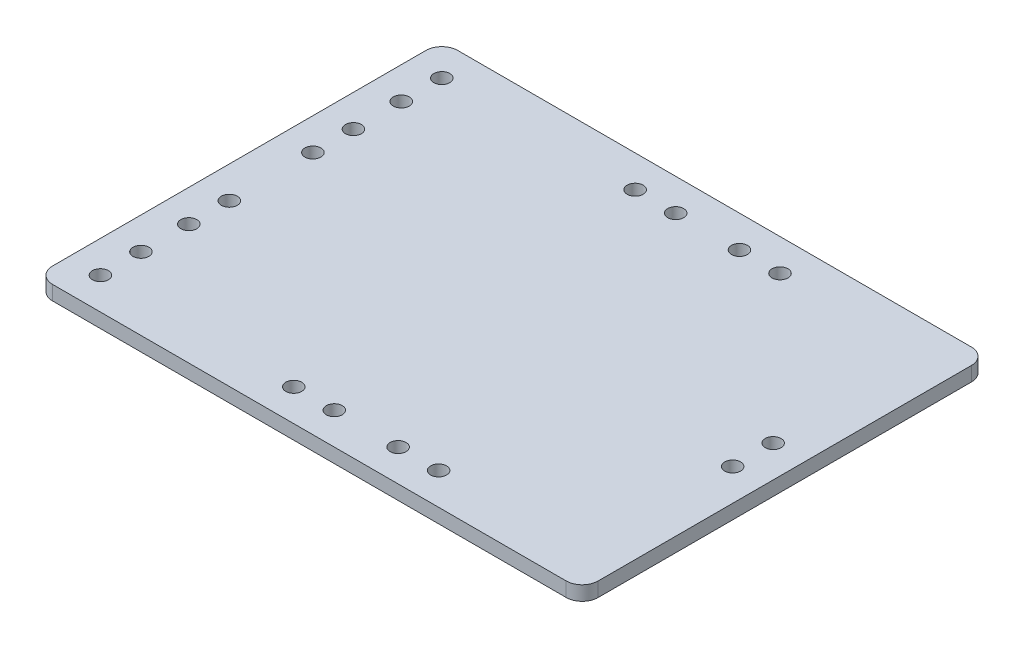
ISO-10303-21;
HEADER;
FILE_DESCRIPTION(('STEP AP214'),'2;1');
FILE_NAME('part.step','',(''),(''),'','','');
FILE_SCHEMA(('AUTOMOTIVE_DESIGN { 1 0 10303 214 1 1 1 1 }'));
ENDSEC;
DATA;
#1=APPLICATION_CONTEXT('core data for automotive mechanical design processes');
#2=APPLICATION_PROTOCOL_DEFINITION('international standard','automotive_design',2000,#1);
#3=PRODUCT_CONTEXT('',#1,'mechanical');
#4=PRODUCT('Part','Part','',(#3));
#5=PRODUCT_RELATED_PRODUCT_CATEGORY('part','',(#4));
#6=PRODUCT_DEFINITION_FORMATION('','',#4);
#7=PRODUCT_DEFINITION_CONTEXT('part definition',#1,'design');
#8=PRODUCT_DEFINITION('design','',#6,#7);
#9=PRODUCT_DEFINITION_SHAPE('','',#8);
#10=(LENGTH_UNIT() NAMED_UNIT(*) SI_UNIT(.MILLI.,.METRE.));
#11=(NAMED_UNIT(*) PLANE_ANGLE_UNIT() SI_UNIT($,.RADIAN.));
#12=(NAMED_UNIT(*) SI_UNIT($,.STERADIAN.) SOLID_ANGLE_UNIT());
#13=UNCERTAINTY_MEASURE_WITH_UNIT(LENGTH_MEASURE(1.E-05),#10,'distance_accuracy_value','');
#14=(GEOMETRIC_REPRESENTATION_CONTEXT(3) GLOBAL_UNCERTAINTY_ASSIGNED_CONTEXT((#13)) GLOBAL_UNIT_ASSIGNED_CONTEXT((#10,
#11,#12)) REPRESENTATION_CONTEXT('',''));
#15=CARTESIAN_POINT('',(0.,0.,0.));
#16=DIRECTION('',(0.,0.,1.));
#17=DIRECTION('',(1.,0.,0.));
#18=AXIS2_PLACEMENT_3D('',#15,#16,#17);
#19=CARTESIAN_POINT('',(-17.1,0.45,12.7));
#20=DIRECTION('',(1.,0.,0.));
#21=DIRECTION('',(0.,0.,-1.));
#22=AXIS2_PLACEMENT_3D('',#19,#20,#21);
#23=PLANE('',#22);
#24=DIRECTION('',(0.,0.,1.));
#25=VECTOR('',#24,1.);
#26=CARTESIAN_POINT('',(-17.1,0.45,12.7));
#27=LINE('',#26,#25);
#28=CARTESIAN_POINT('',(-17.1,0.45,-11.7));
#29=VERTEX_POINT('',#28);
#30=CARTESIAN_POINT('',(-17.1,0.45,11.7));
#31=VERTEX_POINT('',#30);
#32=EDGE_CURVE('E132',#29,#31,#27,.T.);
#33=ORIENTED_EDGE('',*,*,#32,.F.);
#34=DIRECTION('',(0.,-1.,0.));
#35=VECTOR('',#34,1.);
#36=CARTESIAN_POINT('',(-17.1,0.45,-11.7));
#37=LINE('',#36,#35);
#38=CARTESIAN_POINT('',(-17.1,-0.45,-11.7));
#39=VERTEX_POINT('',#38);
#40=EDGE_CURVE('E116',#29,#39,#37,.T.);
#41=ORIENTED_EDGE('',*,*,#40,.T.);
#42=DIRECTION('',(0.,0.,1.));
#43=VECTOR('',#42,1.);
#44=CARTESIAN_POINT('',(-17.1,-0.45,12.7));
#45=LINE('',#44,#43);
#46=CARTESIAN_POINT('',(-17.1,-0.45,11.7));
#47=VERTEX_POINT('',#46);
#48=EDGE_CURVE('E129',#39,#47,#45,.T.);
#49=ORIENTED_EDGE('',*,*,#48,.T.);
#50=DIRECTION('',(0.,-1.,0.));
#51=VECTOR('',#50,1.);
#52=CARTESIAN_POINT('',(-17.1,0.45,11.7));
#53=LINE('',#52,#51);
#54=EDGE_CURVE('E135',#47,#31,#53,.F.);
#55=ORIENTED_EDGE('',*,*,#54,.T.);
#56=EDGE_LOOP('',(#33,#41,#49,#55));
#57=FACE_BOUND('',#56,.T.);
#58=ADVANCED_FACE('F45',(#57),#23,.F.);
#59=CARTESIAN_POINT('',(17.1,0.45,12.7));
#60=DIRECTION('',(0.,0.,-1.));
#61=DIRECTION('',(-1.,0.,0.));
#62=AXIS2_PLACEMENT_3D('',#59,#60,#61);
#63=PLANE('',#62);
#64=DIRECTION('',(1.,0.,0.));
#65=VECTOR('',#64,1.);
#66=CARTESIAN_POINT('',(17.1,-0.45,12.7));
#67=LINE('',#66,#65);
#68=CARTESIAN_POINT('',(-16.1,-0.45,12.7));
#69=VERTEX_POINT('',#68);
#70=CARTESIAN_POINT('',(16.1,-0.45,12.7));
#71=VERTEX_POINT('',#70);
#72=EDGE_CURVE('E140',#69,#71,#67,.T.);
#73=ORIENTED_EDGE('',*,*,#72,.T.);
#74=DIRECTION('',(0.,-1.,0.));
#75=VECTOR('',#74,1.);
#76=CARTESIAN_POINT('',(16.1,0.45,12.7));
#77=LINE('',#76,#75);
#78=CARTESIAN_POINT('',(16.1,0.45,12.7));
#79=VERTEX_POINT('',#78);
#80=EDGE_CURVE('E11',#71,#79,#77,.F.);
#81=ORIENTED_EDGE('',*,*,#80,.T.);
#82=DIRECTION('',(1.,0.,0.));
#83=VECTOR('',#82,1.);
#84=CARTESIAN_POINT('',(17.1,0.45,12.7));
#85=LINE('',#84,#83);
#86=CARTESIAN_POINT('',(-16.1,0.45,12.7));
#87=VERTEX_POINT('',#86);
#88=EDGE_CURVE('E197',#87,#79,#85,.T.);
#89=ORIENTED_EDGE('',*,*,#88,.F.);
#90=DIRECTION('',(0.,-1.,0.));
#91=VECTOR('',#90,1.);
#92=CARTESIAN_POINT('',(-16.1,0.45,12.7));
#93=LINE('',#92,#91);
#94=EDGE_CURVE('E54',#87,#69,#93,.T.);
#95=ORIENTED_EDGE('',*,*,#94,.T.);
#96=EDGE_LOOP('',(#73,#81,#89,#95));
#97=FACE_BOUND('',#96,.T.);
#98=ADVANCED_FACE('F195',(#97),#63,.F.);
#99=CARTESIAN_POINT('',(17.1,0.45,12.7));
#100=DIRECTION('',(-1.,0.,0.));
#101=DIRECTION('',(0.,0.,1.));
#102=AXIS2_PLACEMENT_3D('',#99,#100,#101);
#103=PLANE('',#102);
#104=DIRECTION('',(0.,0.,-1.));
#105=VECTOR('',#104,1.);
#106=CARTESIAN_POINT('',(17.1,-0.45,12.7));
#107=LINE('',#106,#105);
#108=CARTESIAN_POINT('',(17.1,-0.45,11.7));
#109=VERTEX_POINT('',#108);
#110=CARTESIAN_POINT('',(17.1,-0.45,-11.7));
#111=VERTEX_POINT('',#110);
#112=EDGE_CURVE('E146',#109,#111,#107,.T.);
#113=ORIENTED_EDGE('',*,*,#112,.T.);
#114=DIRECTION('',(0.,-1.,0.));
#115=VECTOR('',#114,1.);
#116=CARTESIAN_POINT('',(17.1,0.45,-11.7));
#117=LINE('',#116,#115);
#118=CARTESIAN_POINT('',(17.1,0.45,-11.7));
#119=VERTEX_POINT('',#118);
#120=EDGE_CURVE('E61',#111,#119,#117,.F.);
#121=ORIENTED_EDGE('',*,*,#120,.T.);
#122=DIRECTION('',(0.,0.,-1.));
#123=VECTOR('',#122,1.);
#124=CARTESIAN_POINT('',(17.1,0.45,12.7));
#125=LINE('',#124,#123);
#126=CARTESIAN_POINT('',(17.1,0.45,11.7));
#127=VERTEX_POINT('',#126);
#128=EDGE_CURVE('E205',#127,#119,#125,.T.);
#129=ORIENTED_EDGE('',*,*,#128,.F.);
#130=DIRECTION('',(0.,-1.,0.));
#131=VECTOR('',#130,1.);
#132=CARTESIAN_POINT('',(17.1,0.45,11.7));
#133=LINE('',#132,#131);
#134=EDGE_CURVE('E185',#127,#109,#133,.T.);
#135=ORIENTED_EDGE('',*,*,#134,.T.);
#136=EDGE_LOOP('',(#113,#121,#129,#135));
#137=FACE_BOUND('',#136,.T.);
#138=ADVANCED_FACE('F204',(#137),#103,.F.);
#139=CARTESIAN_POINT('',(17.1,0.45,-12.7));
#140=DIRECTION('',(0.,0.,1.));
#141=DIRECTION('',(1.,0.,0.));
#142=AXIS2_PLACEMENT_3D('',#139,#140,#141);
#143=PLANE('',#142);
#144=DIRECTION('',(-1.,0.,0.));
#145=VECTOR('',#144,1.);
#146=CARTESIAN_POINT('',(17.1,-0.45,-12.7));
#147=LINE('',#146,#145);
#148=CARTESIAN_POINT('',(16.1,-0.45,-12.7));
#149=VERTEX_POINT('',#148);
#150=CARTESIAN_POINT('',(-16.1,-0.45,-12.7));
#151=VERTEX_POINT('',#150);
#152=EDGE_CURVE('E157',#149,#151,#147,.T.);
#153=ORIENTED_EDGE('',*,*,#152,.T.);
#154=DIRECTION('',(0.,-1.,0.));
#155=VECTOR('',#154,1.);
#156=CARTESIAN_POINT('',(-16.1,0.45,-12.7));
#157=LINE('',#156,#155);
#158=CARTESIAN_POINT('',(-16.1,0.45,-12.7));
#159=VERTEX_POINT('',#158);
#160=EDGE_CURVE('E117',#151,#159,#157,.F.);
#161=ORIENTED_EDGE('',*,*,#160,.T.);
#162=DIRECTION('',(-1.,0.,0.));
#163=VECTOR('',#162,1.);
#164=CARTESIAN_POINT('',(17.1,0.45,-12.7));
#165=LINE('',#164,#163);
#166=CARTESIAN_POINT('',(16.1,0.45,-12.7));
#167=VERTEX_POINT('',#166);
#168=EDGE_CURVE('E152',#167,#159,#165,.T.);
#169=ORIENTED_EDGE('',*,*,#168,.F.);
#170=DIRECTION('',(0.,-1.,0.));
#171=VECTOR('',#170,1.);
#172=CARTESIAN_POINT('',(16.1,0.45,-12.7));
#173=LINE('',#172,#171);
#174=EDGE_CURVE('E123',#167,#149,#173,.T.);
#175=ORIENTED_EDGE('',*,*,#174,.T.);
#176=EDGE_LOOP('',(#153,#161,#169,#175));
#177=FACE_BOUND('',#176,.T.);
#178=ADVANCED_FACE('F360',(#177),#143,.F.);
#179=CARTESIAN_POINT('',(0.,0.45,0.));
#180=DIRECTION('',(0.,1.,0.));
#181=DIRECTION('',(0.,0.,1.));
#182=AXIS2_PLACEMENT_3D('',#179,#180,#181);
#183=PLANE('',#182);
#184=CARTESIAN_POINT('',(-0.440000000000002,0.45,10.7));
#185=DIRECTION('',(0.,1.,0.));
#186=DIRECTION('',(0.,0.,-1.));
#187=AXIS2_PLACEMENT_3D('',#184,#185,#186);
#188=CIRCLE('',#187,0.5);
#189=CARTESIAN_POINT('',(-0.440000000000002,0.45,10.2));
#190=VERTEX_POINT('',#189);
#191=EDGE_CURVE('E303',#190,#190,#188,.T.);
#192=ORIENTED_EDGE('',*,*,#191,.F.);
#193=EDGE_LOOP('',(#192));
#194=FACE_BOUND('',#193,.T.);
#195=CARTESIAN_POINT('',(3.56,0.45,10.7));
#196=DIRECTION('',(0.,1.,0.));
#197=DIRECTION('',(0.,0.,-1.));
#198=AXIS2_PLACEMENT_3D('',#195,#196,#197);
#199=CIRCLE('',#198,0.500000000000001);
#200=CARTESIAN_POINT('',(3.56,0.45,10.2));
#201=VERTEX_POINT('',#200);
#202=EDGE_CURVE('E288',#201,#201,#199,.T.);
#203=ORIENTED_EDGE('',*,*,#202,.F.);
#204=EDGE_LOOP('',(#203));
#205=FACE_BOUND('',#204,.T.);
#206=CARTESIAN_POINT('',(6.1,0.45,10.7));
#207=DIRECTION('',(0.,1.,0.));
#208=DIRECTION('',(0.,0.,-1.));
#209=AXIS2_PLACEMENT_3D('',#206,#207,#208);
#210=CIRCLE('',#209,0.5);
#211=CARTESIAN_POINT('',(6.1,0.45,10.2));
#212=VERTEX_POINT('',#211);
#213=EDGE_CURVE('E287',#212,#212,#210,.T.);
#214=ORIENTED_EDGE('',*,*,#213,.F.);
#215=EDGE_LOOP('',(#214));
#216=FACE_BOUND('',#215,.T.);
#217=CARTESIAN_POINT('',(-15.1,0.45,-10.7));
#218=DIRECTION('',(0.,1.,0.));
#219=DIRECTION('',(0.,0.,1.));
#220=AXIS2_PLACEMENT_3D('',#217,#218,#219);
#221=CIRCLE('',#220,0.499999999999999);
#222=CARTESIAN_POINT('',(-15.1,0.45,-10.2));
#223=VERTEX_POINT('',#222);
#224=EDGE_CURVE('E272',#223,#223,#221,.T.);
#225=ORIENTED_EDGE('',*,*,#224,.F.);
#226=EDGE_LOOP('',(#225));
#227=FACE_BOUND('',#226,.T.);
#228=CARTESIAN_POINT('',(-2.98,0.45,10.7));
#229=DIRECTION('',(0.,1.,0.));
#230=DIRECTION('',(0.,0.,-1.));
#231=AXIS2_PLACEMENT_3D('',#228,#229,#230);
#232=CIRCLE('',#231,0.500000000000001);
#233=CARTESIAN_POINT('',(-2.98,0.45,10.2));
#234=VERTEX_POINT('',#233);
#235=EDGE_CURVE('E304',#234,#234,#232,.T.);
#236=ORIENTED_EDGE('',*,*,#235,.F.);
#237=EDGE_LOOP('',(#236));
#238=FACE_BOUND('',#237,.T.);
#239=CARTESIAN_POINT('',(-15.1,0.45,10.7));
#240=DIRECTION('',(0.,1.,0.));
#241=DIRECTION('',(0.,0.,-1.));
#242=AXIS2_PLACEMENT_3D('',#239,#240,#241);
#243=CIRCLE('',#242,0.499999999999999);
#244=CARTESIAN_POINT('',(-15.1,0.45,10.2));
#245=VERTEX_POINT('',#244);
#246=EDGE_CURVE('E336',#245,#245,#243,.T.);
#247=ORIENTED_EDGE('',*,*,#246,.F.);
#248=EDGE_LOOP('',(#247));
#249=FACE_BOUND('',#248,.T.);
#250=CARTESIAN_POINT('',(-15.1,0.45,8.16));
#251=DIRECTION('',(0.,1.,0.));
#252=DIRECTION('',(0.,0.,-1.));
#253=AXIS2_PLACEMENT_3D('',#250,#251,#252);
#254=CIRCLE('',#253,0.499999999999999);
#255=CARTESIAN_POINT('',(-15.1,0.45,7.66));
#256=VERTEX_POINT('',#255);
#257=EDGE_CURVE('E328',#256,#256,#254,.T.);
#258=ORIENTED_EDGE('',*,*,#257,.F.);
#259=EDGE_LOOP('',(#258));
#260=FACE_BOUND('',#259,.T.);
#261=CARTESIAN_POINT('',(-15.1,0.45,5.16));
#262=DIRECTION('',(0.,1.,0.));
#263=DIRECTION('',(0.,0.,-1.));
#264=AXIS2_PLACEMENT_3D('',#261,#262,#263);
#265=CIRCLE('',#264,0.499999999999999);
#266=CARTESIAN_POINT('',(-15.1,0.45,4.66));
#267=VERTEX_POINT('',#266);
#268=EDGE_CURVE('E319',#267,#267,#265,.T.);
#269=ORIENTED_EDGE('',*,*,#268,.F.);
#270=EDGE_LOOP('',(#269));
#271=FACE_BOUND('',#270,.T.);
#272=CARTESIAN_POINT('',(3.56,0.45,-10.7));
#273=DIRECTION('',(0.,1.,0.));
#274=DIRECTION('',(0.,0.,1.));
#275=AXIS2_PLACEMENT_3D('',#272,#273,#274);
#276=CIRCLE('',#275,0.500000000000001);
#277=CARTESIAN_POINT('',(3.56,0.45,-10.2));
#278=VERTEX_POINT('',#277);
#279=EDGE_CURVE('E239',#278,#278,#276,.T.);
#280=ORIENTED_EDGE('',*,*,#279,.F.);
#281=EDGE_LOOP('',(#280));
#282=FACE_BOUND('',#281,.T.);
#283=CARTESIAN_POINT('',(-0.440000000000002,0.45,-10.7));
#284=DIRECTION('',(0.,1.,0.));
#285=DIRECTION('',(0.,0.,1.));
#286=AXIS2_PLACEMENT_3D('',#283,#284,#285);
#287=CIRCLE('',#286,0.5);
#288=CARTESIAN_POINT('',(-0.440000000000002,0.45,-10.2));
#289=VERTEX_POINT('',#288);
#290=EDGE_CURVE('E224',#289,#289,#287,.T.);
#291=ORIENTED_EDGE('',*,*,#290,.F.);
#292=EDGE_LOOP('',(#291));
#293=FACE_BOUND('',#292,.T.);
#294=CARTESIAN_POINT('',(-2.98,0.45,-10.7));
#295=DIRECTION('',(0.,1.,0.));
#296=DIRECTION('',(0.,0.,1.));
#297=AXIS2_PLACEMENT_3D('',#294,#295,#296);
#298=CIRCLE('',#297,0.500000000000001);
#299=CARTESIAN_POINT('',(-2.98,0.45,-10.2));
#300=VERTEX_POINT('',#299);
#301=EDGE_CURVE('E223',#300,#300,#298,.T.);
#302=ORIENTED_EDGE('',*,*,#301,.F.);
#303=EDGE_LOOP('',(#302));
#304=FACE_BOUND('',#303,.T.);
#305=CARTESIAN_POINT('',(15.1,0.45,1.27));
#306=DIRECTION('',(0.,1.,0.));
#307=DIRECTION('',(0.,0.,1.));
#308=AXIS2_PLACEMENT_3D('',#305,#306,#307);
#309=CIRCLE('',#308,0.499999999999999);
#310=CARTESIAN_POINT('',(15.1,0.45,1.77));
#311=VERTEX_POINT('',#310);
#312=EDGE_CURVE('E217',#311,#311,#309,.T.);
#313=ORIENTED_EDGE('',*,*,#312,.F.);
#314=EDGE_LOOP('',(#313));
#315=FACE_BOUND('',#314,.T.);
#316=CARTESIAN_POINT('',(-15.1,0.45,-8.16));
#317=DIRECTION('',(0.,1.,0.));
#318=DIRECTION('',(0.,0.,1.));
#319=AXIS2_PLACEMENT_3D('',#316,#317,#318);
#320=CIRCLE('',#319,0.499999999999999);
#321=CARTESIAN_POINT('',(-15.1,0.45,-7.66));
#322=VERTEX_POINT('',#321);
#323=EDGE_CURVE('E271',#322,#322,#320,.T.);
#324=ORIENTED_EDGE('',*,*,#323,.F.);
#325=EDGE_LOOP('',(#324));
#326=FACE_BOUND('',#325,.T.);
#327=CARTESIAN_POINT('',(-15.1,0.45,-5.16));
#328=DIRECTION('',(0.,1.,0.));
#329=DIRECTION('',(0.,0.,1.));
#330=AXIS2_PLACEMENT_3D('',#327,#328,#329);
#331=CIRCLE('',#330,0.499999999999999);
#332=CARTESIAN_POINT('',(-15.1,0.45,-4.66));
#333=VERTEX_POINT('',#332);
#334=EDGE_CURVE('E256',#333,#333,#331,.T.);
#335=ORIENTED_EDGE('',*,*,#334,.F.);
#336=EDGE_LOOP('',(#335));
#337=FACE_BOUND('',#336,.T.);
#338=CARTESIAN_POINT('',(-15.1,0.45,-2.62));
#339=DIRECTION('',(0.,1.,0.));
#340=DIRECTION('',(0.,0.,1.));
#341=AXIS2_PLACEMENT_3D('',#338,#339,#340);
#342=CIRCLE('',#341,0.499999999999999);
#343=CARTESIAN_POINT('',(-15.1,0.45,-2.12));
#344=VERTEX_POINT('',#343);
#345=EDGE_CURVE('E255',#344,#344,#342,.T.);
#346=ORIENTED_EDGE('',*,*,#345,.F.);
#347=EDGE_LOOP('',(#346));
#348=FACE_BOUND('',#347,.T.);
#349=CARTESIAN_POINT('',(6.1,0.45,-10.7));
#350=DIRECTION('',(0.,1.,0.));
#351=DIRECTION('',(0.,0.,1.));
#352=AXIS2_PLACEMENT_3D('',#349,#350,#351);
#353=CIRCLE('',#352,0.5);
#354=CARTESIAN_POINT('',(6.1,0.45,-10.2));
#355=VERTEX_POINT('',#354);
#356=EDGE_CURVE('E240',#355,#355,#353,.T.);
#357=ORIENTED_EDGE('',*,*,#356,.F.);
#358=EDGE_LOOP('',(#357));
#359=FACE_BOUND('',#358,.T.);
#360=CARTESIAN_POINT('',(-15.1,0.45,2.62));
#361=DIRECTION('',(0.,1.,0.));
#362=DIRECTION('',(0.,0.,-1.));
#363=AXIS2_PLACEMENT_3D('',#360,#361,#362);
#364=CIRCLE('',#363,0.499999999999999);
#365=CARTESIAN_POINT('',(-15.1,0.45,2.12));
#366=VERTEX_POINT('',#365);
#367=EDGE_CURVE('E320',#366,#366,#364,.T.);
#368=ORIENTED_EDGE('',*,*,#367,.F.);
#369=EDGE_LOOP('',(#368));
#370=FACE_BOUND('',#369,.T.);
#371=CARTESIAN_POINT('',(15.1,0.45,-1.27));
#372=DIRECTION('',(0.,1.,0.));
#373=DIRECTION('',(0.,0.,1.));
#374=AXIS2_PLACEMENT_3D('',#371,#372,#373);
#375=CIRCLE('',#374,0.499999999999999);
#376=CARTESIAN_POINT('',(15.1,0.45,-0.770000000000001));
#377=VERTEX_POINT('',#376);
#378=EDGE_CURVE('E149',#377,#377,#375,.T.);
#379=ORIENTED_EDGE('',*,*,#378,.F.);
#380=EDGE_LOOP('',(#379));
#381=FACE_BOUND('',#380,.T.);
#382=ORIENTED_EDGE('',*,*,#168,.T.);
#383=CARTESIAN_POINT('',(-16.1,0.45,-11.7));
#384=DIRECTION('',(0.,1.,0.));
#385=DIRECTION('',(0.,0.,1.));
#386=AXIS2_PLACEMENT_3D('',#383,#384,#385);
#387=CIRCLE('',#386,1.);
#388=EDGE_CURVE('E182',#159,#29,#387,.T.);
#389=ORIENTED_EDGE('',*,*,#388,.T.);
#390=ORIENTED_EDGE('',*,*,#32,.T.);
#391=CARTESIAN_POINT('',(-16.1,0.45,11.7));
#392=DIRECTION('',(0.,1.,0.));
#393=DIRECTION('',(0.,0.,1.));
#394=AXIS2_PLACEMENT_3D('',#391,#392,#393);
#395=CIRCLE('',#394,1.);
#396=EDGE_CURVE('E174',#31,#87,#395,.T.);
#397=ORIENTED_EDGE('',*,*,#396,.T.);
#398=ORIENTED_EDGE('',*,*,#88,.T.);
#399=CARTESIAN_POINT('',(16.1,0.45,11.7));
#400=DIRECTION('',(0.,1.,0.));
#401=DIRECTION('',(0.,0.,1.));
#402=AXIS2_PLACEMENT_3D('',#399,#400,#401);
#403=CIRCLE('',#402,1.);
#404=EDGE_CURVE('E68',#79,#127,#403,.T.);
#405=ORIENTED_EDGE('',*,*,#404,.T.);
#406=ORIENTED_EDGE('',*,*,#128,.T.);
#407=CARTESIAN_POINT('',(16.1,0.45,-11.7));
#408=DIRECTION('',(0.,1.,0.));
#409=DIRECTION('',(0.,0.,1.));
#410=AXIS2_PLACEMENT_3D('',#407,#408,#409);
#411=CIRCLE('',#410,1.);
#412=EDGE_CURVE('E179',#119,#167,#411,.T.);
#413=ORIENTED_EDGE('',*,*,#412,.T.);
#414=EDGE_LOOP('',(#382,#389,#390,#397,#398,#405,#406,#413));
#415=FACE_BOUND('',#414,.T.);
#416=ADVANCED_FACE('F357',(#194,#205,#216,#227,#238,#249,#260,#271,#282,#293,#304,#315,#326,
#337,#348,#359,#370,#381,#415),#183,.T.);
#417=CARTESIAN_POINT('',(0.,-0.45,0.));
#418=DIRECTION('',(0.,1.,0.));
#419=DIRECTION('',(0.,0.,1.));
#420=AXIS2_PLACEMENT_3D('',#417,#418,#419);
#421=PLANE('',#420);
#422=CARTESIAN_POINT('',(-0.440000000000002,-0.45,10.7));
#423=DIRECTION('',(0.,1.,0.));
#424=DIRECTION('',(0.,0.,-1.));
#425=AXIS2_PLACEMENT_3D('',#422,#423,#424);
#426=CIRCLE('',#425,0.5);
#427=CARTESIAN_POINT('',(-0.440000000000002,-0.45,10.2));
#428=VERTEX_POINT('',#427);
#429=EDGE_CURVE('E299',#428,#428,#426,.T.);
#430=ORIENTED_EDGE('',*,*,#429,.T.);
#431=EDGE_LOOP('',(#430));
#432=FACE_BOUND('',#431,.T.);
#433=CARTESIAN_POINT('',(3.56,-0.45,10.7));
#434=DIRECTION('',(0.,1.,0.));
#435=DIRECTION('',(0.,0.,-1.));
#436=AXIS2_PLACEMENT_3D('',#433,#434,#435);
#437=CIRCLE('',#436,0.500000000000001);
#438=CARTESIAN_POINT('',(3.56,-0.45,10.2));
#439=VERTEX_POINT('',#438);
#440=EDGE_CURVE('E308',#439,#439,#437,.T.);
#441=ORIENTED_EDGE('',*,*,#440,.T.);
#442=EDGE_LOOP('',(#441));
#443=FACE_BOUND('',#442,.T.);
#444=CARTESIAN_POINT('',(6.1,-0.45,10.7));
#445=DIRECTION('',(0.,1.,0.));
#446=DIRECTION('',(0.,0.,-1.));
#447=AXIS2_PLACEMENT_3D('',#444,#445,#446);
#448=CIRCLE('',#447,0.5);
#449=CARTESIAN_POINT('',(6.1,-0.45,10.2));
#450=VERTEX_POINT('',#449);
#451=EDGE_CURVE('E283',#450,#450,#448,.T.);
#452=ORIENTED_EDGE('',*,*,#451,.T.);
#453=EDGE_LOOP('',(#452));
#454=FACE_BOUND('',#453,.T.);
#455=CARTESIAN_POINT('',(-15.1,-0.45,-10.7));
#456=DIRECTION('',(0.,1.,0.));
#457=DIRECTION('',(0.,0.,1.));
#458=AXIS2_PLACEMENT_3D('',#455,#456,#457);
#459=CIRCLE('',#458,0.499999999999999);
#460=CARTESIAN_POINT('',(-15.1,-0.45,-10.2));
#461=VERTEX_POINT('',#460);
#462=EDGE_CURVE('E292',#461,#461,#459,.T.);
#463=ORIENTED_EDGE('',*,*,#462,.T.);
#464=EDGE_LOOP('',(#463));
#465=FACE_BOUND('',#464,.T.);
#466=CARTESIAN_POINT('',(-2.98,-0.45,10.7));
#467=DIRECTION('',(0.,1.,0.));
#468=DIRECTION('',(0.,0.,-1.));
#469=AXIS2_PLACEMENT_3D('',#466,#467,#468);
#470=CIRCLE('',#469,0.500000000000001);
#471=CARTESIAN_POINT('',(-2.98,-0.45,10.2));
#472=VERTEX_POINT('',#471);
#473=EDGE_CURVE('E340',#472,#472,#470,.T.);
#474=ORIENTED_EDGE('',*,*,#473,.T.);
#475=EDGE_LOOP('',(#474));
#476=FACE_BOUND('',#475,.T.);
#477=CARTESIAN_POINT('',(-15.1,-0.45,10.7));
#478=DIRECTION('',(0.,1.,0.));
#479=DIRECTION('',(0.,0.,-1.));
#480=AXIS2_PLACEMENT_3D('',#477,#478,#479);
#481=CIRCLE('',#480,0.499999999999999);
#482=CARTESIAN_POINT('',(-15.1,-0.45,10.2));
#483=VERTEX_POINT('',#482);
#484=EDGE_CURVE('E332',#483,#483,#481,.T.);
#485=ORIENTED_EDGE('',*,*,#484,.T.);
#486=EDGE_LOOP('',(#485));
#487=FACE_BOUND('',#486,.T.);
#488=CARTESIAN_POINT('',(-15.1,-0.45,8.16));
#489=DIRECTION('',(0.,1.,0.));
#490=DIRECTION('',(0.,0.,-1.));
#491=AXIS2_PLACEMENT_3D('',#488,#489,#490);
#492=CIRCLE('',#491,0.499999999999999);
#493=CARTESIAN_POINT('',(-15.1,-0.45,7.66));
#494=VERTEX_POINT('',#493);
#495=EDGE_CURVE('E324',#494,#494,#492,.T.);
#496=ORIENTED_EDGE('',*,*,#495,.T.);
#497=EDGE_LOOP('',(#496));
#498=FACE_BOUND('',#497,.T.);
#499=CARTESIAN_POINT('',(-15.1,-0.45,5.16));
#500=DIRECTION('',(0.,1.,0.));
#501=DIRECTION('',(0.,0.,-1.));
#502=AXIS2_PLACEMENT_3D('',#499,#500,#501);
#503=CIRCLE('',#502,0.499999999999999);
#504=CARTESIAN_POINT('',(-15.1,-0.45,4.66));
#505=VERTEX_POINT('',#504);
#506=EDGE_CURVE('E315',#505,#505,#503,.T.);
#507=ORIENTED_EDGE('',*,*,#506,.T.);
#508=EDGE_LOOP('',(#507));
#509=FACE_BOUND('',#508,.T.);
#510=CARTESIAN_POINT('',(3.56,-0.45,-10.7));
#511=DIRECTION('',(0.,1.,0.));
#512=DIRECTION('',(0.,0.,1.));
#513=AXIS2_PLACEMENT_3D('',#510,#511,#512);
#514=CIRCLE('',#513,0.500000000000001);
#515=CARTESIAN_POINT('',(3.56,-0.45,-10.2));
#516=VERTEX_POINT('',#515);
#517=EDGE_CURVE('E235',#516,#516,#514,.T.);
#518=ORIENTED_EDGE('',*,*,#517,.T.);
#519=EDGE_LOOP('',(#518));
#520=FACE_BOUND('',#519,.T.);
#521=CARTESIAN_POINT('',(-0.440000000000002,-0.45,-10.7));
#522=DIRECTION('',(0.,1.,0.));
#523=DIRECTION('',(0.,0.,1.));
#524=AXIS2_PLACEMENT_3D('',#521,#522,#523);
#525=CIRCLE('',#524,0.5);
#526=CARTESIAN_POINT('',(-0.440000000000002,-0.45,-10.2));
#527=VERTEX_POINT('',#526);
#528=EDGE_CURVE('E244',#527,#527,#525,.T.);
#529=ORIENTED_EDGE('',*,*,#528,.T.);
#530=EDGE_LOOP('',(#529));
#531=FACE_BOUND('',#530,.T.);
#532=CARTESIAN_POINT('',(-2.98,-0.45,-10.7));
#533=DIRECTION('',(0.,1.,0.));
#534=DIRECTION('',(0.,0.,1.));
#535=AXIS2_PLACEMENT_3D('',#532,#533,#534);
#536=CIRCLE('',#535,0.500000000000001);
#537=CARTESIAN_POINT('',(-2.98,-0.45,-10.2));
#538=VERTEX_POINT('',#537);
#539=EDGE_CURVE('E219',#538,#538,#536,.T.);
#540=ORIENTED_EDGE('',*,*,#539,.T.);
#541=EDGE_LOOP('',(#540));
#542=FACE_BOUND('',#541,.T.);
#543=CARTESIAN_POINT('',(15.1,-0.45,1.27));
#544=DIRECTION('',(0.,1.,0.));
#545=DIRECTION('',(0.,0.,1.));
#546=AXIS2_PLACEMENT_3D('',#543,#544,#545);
#547=CIRCLE('',#546,0.499999999999999);
#548=CARTESIAN_POINT('',(15.1,-0.45,1.77));
#549=VERTEX_POINT('',#548);
#550=EDGE_CURVE('E228',#549,#549,#547,.T.);
#551=ORIENTED_EDGE('',*,*,#550,.T.);
#552=EDGE_LOOP('',(#551));
#553=FACE_BOUND('',#552,.T.);
#554=CARTESIAN_POINT('',(-15.1,-0.45,-8.16));
#555=DIRECTION('',(0.,1.,0.));
#556=DIRECTION('',(0.,0.,1.));
#557=AXIS2_PLACEMENT_3D('',#554,#555,#556);
#558=CIRCLE('',#557,0.499999999999999);
#559=CARTESIAN_POINT('',(-15.1,-0.45,-7.66));
#560=VERTEX_POINT('',#559);
#561=EDGE_CURVE('E267',#560,#560,#558,.T.);
#562=ORIENTED_EDGE('',*,*,#561,.T.);
#563=EDGE_LOOP('',(#562));
#564=FACE_BOUND('',#563,.T.);
#565=CARTESIAN_POINT('',(-15.1,-0.45,-5.16));
#566=DIRECTION('',(0.,1.,0.));
#567=DIRECTION('',(0.,0.,1.));
#568=AXIS2_PLACEMENT_3D('',#565,#566,#567);
#569=CIRCLE('',#568,0.499999999999999);
#570=CARTESIAN_POINT('',(-15.1,-0.45,-4.66));
#571=VERTEX_POINT('',#570);
#572=EDGE_CURVE('E276',#571,#571,#569,.T.);
#573=ORIENTED_EDGE('',*,*,#572,.T.);
#574=EDGE_LOOP('',(#573));
#575=FACE_BOUND('',#574,.T.);
#576=CARTESIAN_POINT('',(-15.1,-0.45,-2.62));
#577=DIRECTION('',(0.,1.,0.));
#578=DIRECTION('',(0.,0.,1.));
#579=AXIS2_PLACEMENT_3D('',#576,#577,#578);
#580=CIRCLE('',#579,0.499999999999999);
#581=CARTESIAN_POINT('',(-15.1,-0.45,-2.12));
#582=VERTEX_POINT('',#581);
#583=EDGE_CURVE('E251',#582,#582,#580,.T.);
#584=ORIENTED_EDGE('',*,*,#583,.T.);
#585=EDGE_LOOP('',(#584));
#586=FACE_BOUND('',#585,.T.);
#587=CARTESIAN_POINT('',(6.1,-0.45,-10.7));
#588=DIRECTION('',(0.,1.,0.));
#589=DIRECTION('',(0.,0.,1.));
#590=AXIS2_PLACEMENT_3D('',#587,#588,#589);
#591=CIRCLE('',#590,0.5);
#592=CARTESIAN_POINT('',(6.1,-0.45,-10.2));
#593=VERTEX_POINT('',#592);
#594=EDGE_CURVE('E260',#593,#593,#591,.T.);
#595=ORIENTED_EDGE('',*,*,#594,.T.);
#596=EDGE_LOOP('',(#595));
#597=FACE_BOUND('',#596,.T.);
#598=CARTESIAN_POINT('',(-15.1,-0.45,2.62));
#599=DIRECTION('',(0.,1.,0.));
#600=DIRECTION('',(0.,0.,-1.));
#601=AXIS2_PLACEMENT_3D('',#598,#599,#600);
#602=CIRCLE('',#601,0.499999999999999);
#603=CARTESIAN_POINT('',(-15.1,-0.45,2.12));
#604=VERTEX_POINT('',#603);
#605=EDGE_CURVE('E347',#604,#604,#602,.T.);
#606=ORIENTED_EDGE('',*,*,#605,.T.);
#607=EDGE_LOOP('',(#606));
#608=FACE_BOUND('',#607,.T.);
#609=CARTESIAN_POINT('',(15.1,-0.45,-1.27));
#610=DIRECTION('',(0.,1.,0.));
#611=DIRECTION('',(0.,0.,1.));
#612=AXIS2_PLACEMENT_3D('',#609,#610,#611);
#613=CIRCLE('',#612,0.499999999999999);
#614=CARTESIAN_POINT('',(15.1,-0.45,-0.770000000000001));
#615=VERTEX_POINT('',#614);
#616=EDGE_CURVE('E141',#615,#615,#613,.T.);
#617=ORIENTED_EDGE('',*,*,#616,.T.);
#618=EDGE_LOOP('',(#617));
#619=FACE_BOUND('',#618,.T.);
#620=ORIENTED_EDGE('',*,*,#48,.F.);
#621=CARTESIAN_POINT('',(-16.1,-0.45,-11.7));
#622=DIRECTION('',(0.,1.,0.));
#623=DIRECTION('',(0.,0.,1.));
#624=AXIS2_PLACEMENT_3D('',#621,#622,#623);
#625=CIRCLE('',#624,1.);
#626=EDGE_CURVE('E112',#39,#151,#625,.F.);
#627=ORIENTED_EDGE('',*,*,#626,.T.);
#628=ORIENTED_EDGE('',*,*,#152,.F.);
#629=CARTESIAN_POINT('',(16.1,-0.45,-11.7));
#630=DIRECTION('',(0.,1.,0.));
#631=DIRECTION('',(0.,0.,1.));
#632=AXIS2_PLACEMENT_3D('',#629,#630,#631);
#633=CIRCLE('',#632,1.);
#634=EDGE_CURVE('E124',#149,#111,#633,.F.);
#635=ORIENTED_EDGE('',*,*,#634,.T.);
#636=ORIENTED_EDGE('',*,*,#112,.F.);
#637=CARTESIAN_POINT('',(16.1,-0.45,11.7));
#638=DIRECTION('',(0.,1.,0.));
#639=DIRECTION('',(0.,0.,1.));
#640=AXIS2_PLACEMENT_3D('',#637,#638,#639);
#641=CIRCLE('',#640,1.);
#642=EDGE_CURVE('E164',#109,#71,#641,.F.);
#643=ORIENTED_EDGE('',*,*,#642,.T.);
#644=ORIENTED_EDGE('',*,*,#72,.F.);
#645=CARTESIAN_POINT('',(-16.1,-0.45,11.7));
#646=DIRECTION('',(0.,1.,0.));
#647=DIRECTION('',(0.,0.,1.));
#648=AXIS2_PLACEMENT_3D('',#645,#646,#647);
#649=CIRCLE('',#648,1.);
#650=EDGE_CURVE('E134',#69,#47,#649,.F.);
#651=ORIENTED_EDGE('',*,*,#650,.T.);
#652=EDGE_LOOP('',(#620,#627,#628,#635,#636,#643,#644,#651));
#653=FACE_BOUND('',#652,.T.);
#654=ADVANCED_FACE('F137',(#432,#443,#454,#465,#476,#487,#498,#509,#520,#531,#542,#553,#564,
#575,#586,#597,#608,#619,#653),#421,.F.);
#655=CARTESIAN_POINT('',(15.1,-0.45,-1.27));
#656=DIRECTION('',(0.,1.,0.));
#657=DIRECTION('',(0.,0.,1.));
#658=AXIS2_PLACEMENT_3D('',#655,#656,#657);
#659=CYLINDRICAL_SURFACE('',#658,0.499999999999999);
#660=ORIENTED_EDGE('',*,*,#616,.F.);
#661=EDGE_LOOP('',(#660));
#662=FACE_BOUND('',#661,.T.);
#663=ORIENTED_EDGE('',*,*,#378,.T.);
#664=EDGE_LOOP('',(#663));
#665=FACE_BOUND('',#664,.T.);
#666=ADVANCED_FACE('F390',(#662,#665),#659,.F.);
#667=CARTESIAN_POINT('',(-15.1,-0.45,2.62));
#668=DIRECTION('',(0.,1.,0.));
#669=DIRECTION('',(0.,0.,1.));
#670=AXIS2_PLACEMENT_3D('',#667,#668,#669);
#671=CYLINDRICAL_SURFACE('',#670,0.499999999999999);
#672=ORIENTED_EDGE('',*,*,#605,.F.);
#673=EDGE_LOOP('',(#672));
#674=FACE_BOUND('',#673,.T.);
#675=ORIENTED_EDGE('',*,*,#367,.T.);
#676=EDGE_LOOP('',(#675));
#677=FACE_BOUND('',#676,.T.);
#678=ADVANCED_FACE('F355',(#674,#677),#671,.F.);
#679=CARTESIAN_POINT('',(6.1,-0.45,-10.7));
#680=DIRECTION('',(0.,1.,0.));
#681=DIRECTION('',(0.,0.,1.));
#682=AXIS2_PLACEMENT_3D('',#679,#680,#681);
#683=CYLINDRICAL_SURFACE('',#682,0.5);
#684=ORIENTED_EDGE('',*,*,#594,.F.);
#685=EDGE_LOOP('',(#684));
#686=FACE_BOUND('',#685,.T.);
#687=ORIENTED_EDGE('',*,*,#356,.T.);
#688=EDGE_LOOP('',(#687));
#689=FACE_BOUND('',#688,.T.);
#690=ADVANCED_FACE('F418',(#686,#689),#683,.F.);
#691=CARTESIAN_POINT('',(-15.1,-0.45,-2.62));
#692=DIRECTION('',(0.,1.,0.));
#693=DIRECTION('',(0.,0.,1.));
#694=AXIS2_PLACEMENT_3D('',#691,#692,#693);
#695=CYLINDRICAL_SURFACE('',#694,0.499999999999999);
#696=ORIENTED_EDGE('',*,*,#583,.F.);
#697=EDGE_LOOP('',(#696));
#698=FACE_BOUND('',#697,.T.);
#699=ORIENTED_EDGE('',*,*,#345,.T.);
#700=EDGE_LOOP('',(#699));
#701=FACE_BOUND('',#700,.T.);
#702=ADVANCED_FACE('F414',(#698,#701),#695,.F.);
#703=CARTESIAN_POINT('',(-15.1,-0.45,-5.16));
#704=DIRECTION('',(0.,1.,0.));
#705=DIRECTION('',(0.,0.,1.));
#706=AXIS2_PLACEMENT_3D('',#703,#704,#705);
#707=CYLINDRICAL_SURFACE('',#706,0.499999999999999);
#708=ORIENTED_EDGE('',*,*,#572,.F.);
#709=EDGE_LOOP('',(#708));
#710=FACE_BOUND('',#709,.T.);
#711=ORIENTED_EDGE('',*,*,#334,.T.);
#712=EDGE_LOOP('',(#711));
#713=FACE_BOUND('',#712,.T.);
#714=ADVANCED_FACE('F417',(#710,#713),#707,.F.);
#715=CARTESIAN_POINT('',(-15.1,-0.45,-8.16));
#716=DIRECTION('',(0.,1.,0.));
#717=DIRECTION('',(0.,0.,1.));
#718=AXIS2_PLACEMENT_3D('',#715,#716,#717);
#719=CYLINDRICAL_SURFACE('',#718,0.499999999999999);
#720=ORIENTED_EDGE('',*,*,#561,.F.);
#721=EDGE_LOOP('',(#720));
#722=FACE_BOUND('',#721,.T.);
#723=ORIENTED_EDGE('',*,*,#323,.T.);
#724=EDGE_LOOP('',(#723));
#725=FACE_BOUND('',#724,.T.);
#726=ADVANCED_FACE('F404',(#722,#725),#719,.F.);
#727=CARTESIAN_POINT('',(15.1,-0.45,1.27));
#728=DIRECTION('',(0.,1.,0.));
#729=DIRECTION('',(0.,0.,1.));
#730=AXIS2_PLACEMENT_3D('',#727,#728,#729);
#731=CYLINDRICAL_SURFACE('',#730,0.499999999999999);
#732=ORIENTED_EDGE('',*,*,#550,.F.);
#733=EDGE_LOOP('',(#732));
#734=FACE_BOUND('',#733,.T.);
#735=ORIENTED_EDGE('',*,*,#312,.T.);
#736=EDGE_LOOP('',(#735));
#737=FACE_BOUND('',#736,.T.);
#738=ADVANCED_FACE('F400',(#734,#737),#731,.F.);
#739=CARTESIAN_POINT('',(-2.98,-0.45,-10.7));
#740=DIRECTION('',(0.,1.,0.));
#741=DIRECTION('',(0.,0.,1.));
#742=AXIS2_PLACEMENT_3D('',#739,#740,#741);
#743=CYLINDRICAL_SURFACE('',#742,0.500000000000001);
#744=ORIENTED_EDGE('',*,*,#539,.F.);
#745=EDGE_LOOP('',(#744));
#746=FACE_BOUND('',#745,.T.);
#747=ORIENTED_EDGE('',*,*,#301,.T.);
#748=EDGE_LOOP('',(#747));
#749=FACE_BOUND('',#748,.T.);
#750=ADVANCED_FACE('F396',(#746,#749),#743,.F.);
#751=CARTESIAN_POINT('',(-0.440000000000002,-0.45,-10.7));
#752=DIRECTION('',(0.,1.,0.));
#753=DIRECTION('',(0.,0.,1.));
#754=AXIS2_PLACEMENT_3D('',#751,#752,#753);
#755=CYLINDRICAL_SURFACE('',#754,0.5);
#756=ORIENTED_EDGE('',*,*,#528,.F.);
#757=EDGE_LOOP('',(#756));
#758=FACE_BOUND('',#757,.T.);
#759=ORIENTED_EDGE('',*,*,#290,.T.);
#760=EDGE_LOOP('',(#759));
#761=FACE_BOUND('',#760,.T.);
#762=ADVANCED_FACE('F399',(#758,#761),#755,.F.);
#763=CARTESIAN_POINT('',(3.56,-0.45,-10.7));
#764=DIRECTION('',(0.,1.,0.));
#765=DIRECTION('',(0.,0.,1.));
#766=AXIS2_PLACEMENT_3D('',#763,#764,#765);
#767=CYLINDRICAL_SURFACE('',#766,0.500000000000001);
#768=ORIENTED_EDGE('',*,*,#517,.F.);
#769=EDGE_LOOP('',(#768));
#770=FACE_BOUND('',#769,.T.);
#771=ORIENTED_EDGE('',*,*,#279,.T.);
#772=EDGE_LOOP('',(#771));
#773=FACE_BOUND('',#772,.T.);
#774=ADVANCED_FACE('F406',(#770,#773),#767,.F.);
#775=CARTESIAN_POINT('',(-15.1,-0.45,5.16));
#776=DIRECTION('',(0.,1.,0.));
#777=DIRECTION('',(0.,0.,1.));
#778=AXIS2_PLACEMENT_3D('',#775,#776,#777);
#779=CYLINDRICAL_SURFACE('',#778,0.499999999999999);
#780=ORIENTED_EDGE('',*,*,#506,.F.);
#781=EDGE_LOOP('',(#780));
#782=FACE_BOUND('',#781,.T.);
#783=ORIENTED_EDGE('',*,*,#268,.T.);
#784=EDGE_LOOP('',(#783));
#785=FACE_BOUND('',#784,.T.);
#786=ADVANCED_FACE('F409',(#782,#785),#779,.F.);
#787=CARTESIAN_POINT('',(-15.1,-0.45,8.16));
#788=DIRECTION('',(0.,1.,0.));
#789=DIRECTION('',(0.,0.,1.));
#790=AXIS2_PLACEMENT_3D('',#787,#788,#789);
#791=CYLINDRICAL_SURFACE('',#790,0.499999999999999);
#792=ORIENTED_EDGE('',*,*,#495,.F.);
#793=EDGE_LOOP('',(#792));
#794=FACE_BOUND('',#793,.T.);
#795=ORIENTED_EDGE('',*,*,#257,.T.);
#796=EDGE_LOOP('',(#795));
#797=FACE_BOUND('',#796,.T.);
#798=ADVANCED_FACE('F446',(#794,#797),#791,.F.);
#799=CARTESIAN_POINT('',(-15.1,-0.45,10.7));
#800=DIRECTION('',(0.,1.,0.));
#801=DIRECTION('',(0.,0.,1.));
#802=AXIS2_PLACEMENT_3D('',#799,#800,#801);
#803=CYLINDRICAL_SURFACE('',#802,0.499999999999999);
#804=ORIENTED_EDGE('',*,*,#484,.F.);
#805=EDGE_LOOP('',(#804));
#806=FACE_BOUND('',#805,.T.);
#807=ORIENTED_EDGE('',*,*,#246,.T.);
#808=EDGE_LOOP('',(#807));
#809=FACE_BOUND('',#808,.T.);
#810=ADVANCED_FACE('F450',(#806,#809),#803,.F.);
#811=CARTESIAN_POINT('',(-2.98,-0.45,10.7));
#812=DIRECTION('',(0.,1.,0.));
#813=DIRECTION('',(0.,0.,1.));
#814=AXIS2_PLACEMENT_3D('',#811,#812,#813);
#815=CYLINDRICAL_SURFACE('',#814,0.500000000000001);
#816=ORIENTED_EDGE('',*,*,#473,.F.);
#817=EDGE_LOOP('',(#816));
#818=FACE_BOUND('',#817,.T.);
#819=ORIENTED_EDGE('',*,*,#235,.T.);
#820=EDGE_LOOP('',(#819));
#821=FACE_BOUND('',#820,.T.);
#822=ADVANCED_FACE('F437',(#818,#821),#815,.F.);
#823=CARTESIAN_POINT('',(-15.1,-0.45,-10.7));
#824=DIRECTION('',(0.,1.,0.));
#825=DIRECTION('',(0.,0.,1.));
#826=AXIS2_PLACEMENT_3D('',#823,#824,#825);
#827=CYLINDRICAL_SURFACE('',#826,0.499999999999999);
#828=ORIENTED_EDGE('',*,*,#462,.F.);
#829=EDGE_LOOP('',(#828));
#830=FACE_BOUND('',#829,.T.);
#831=ORIENTED_EDGE('',*,*,#224,.T.);
#832=EDGE_LOOP('',(#831));
#833=FACE_BOUND('',#832,.T.);
#834=ADVANCED_FACE('F433',(#830,#833),#827,.F.);
#835=CARTESIAN_POINT('',(6.1,-0.45,10.7));
#836=DIRECTION('',(0.,1.,0.));
#837=DIRECTION('',(0.,0.,1.));
#838=AXIS2_PLACEMENT_3D('',#835,#836,#837);
#839=CYLINDRICAL_SURFACE('',#838,0.5);
#840=ORIENTED_EDGE('',*,*,#451,.F.);
#841=EDGE_LOOP('',(#840));
#842=FACE_BOUND('',#841,.T.);
#843=ORIENTED_EDGE('',*,*,#213,.T.);
#844=EDGE_LOOP('',(#843));
#845=FACE_BOUND('',#844,.T.);
#846=ADVANCED_FACE('F429',(#842,#845),#839,.F.);
#847=CARTESIAN_POINT('',(3.56,-0.45,10.7));
#848=DIRECTION('',(0.,1.,0.));
#849=DIRECTION('',(0.,0.,1.));
#850=AXIS2_PLACEMENT_3D('',#847,#848,#849);
#851=CYLINDRICAL_SURFACE('',#850,0.500000000000001);
#852=ORIENTED_EDGE('',*,*,#440,.F.);
#853=EDGE_LOOP('',(#852));
#854=FACE_BOUND('',#853,.T.);
#855=ORIENTED_EDGE('',*,*,#202,.T.);
#856=EDGE_LOOP('',(#855));
#857=FACE_BOUND('',#856,.T.);
#858=ADVANCED_FACE('F432',(#854,#857),#851,.F.);
#859=CARTESIAN_POINT('',(-0.440000000000002,-0.45,10.7));
#860=DIRECTION('',(0.,1.,0.));
#861=DIRECTION('',(0.,0.,1.));
#862=AXIS2_PLACEMENT_3D('',#859,#860,#861);
#863=CYLINDRICAL_SURFACE('',#862,0.5);
#864=ORIENTED_EDGE('',*,*,#429,.F.);
#865=EDGE_LOOP('',(#864));
#866=FACE_BOUND('',#865,.T.);
#867=ORIENTED_EDGE('',*,*,#191,.T.);
#868=EDGE_LOOP('',(#867));
#869=FACE_BOUND('',#868,.T.);
#870=ADVANCED_FACE('F375',(#866,#869),#863,.F.);
#871=CARTESIAN_POINT('',(-16.1,0.45,-11.7));
#872=DIRECTION('',(0.,-1.,0.));
#873=DIRECTION('',(0.,0.,-1.));
#874=AXIS2_PLACEMENT_3D('',#871,#872,#873);
#875=CYLINDRICAL_SURFACE('',#874,1.);
#876=ORIENTED_EDGE('',*,*,#388,.F.);
#877=ORIENTED_EDGE('',*,*,#160,.F.);
#878=ORIENTED_EDGE('',*,*,#626,.F.);
#879=ORIENTED_EDGE('',*,*,#40,.F.);
#880=EDGE_LOOP('',(#876,#877,#878,#879));
#881=FACE_BOUND('',#880,.T.);
#882=ADVANCED_FACE('F115',(#881),#875,.T.);
#883=CARTESIAN_POINT('',(16.1,0.45,-11.7));
#884=DIRECTION('',(0.,-1.,0.));
#885=DIRECTION('',(0.,0.,-1.));
#886=AXIS2_PLACEMENT_3D('',#883,#884,#885);
#887=CYLINDRICAL_SURFACE('',#886,1.);
#888=ORIENTED_EDGE('',*,*,#412,.F.);
#889=ORIENTED_EDGE('',*,*,#120,.F.);
#890=ORIENTED_EDGE('',*,*,#634,.F.);
#891=ORIENTED_EDGE('',*,*,#174,.F.);
#892=EDGE_LOOP('',(#888,#889,#890,#891));
#893=FACE_BOUND('',#892,.T.);
#894=ADVANCED_FACE('F368',(#893),#887,.T.);
#895=CARTESIAN_POINT('',(16.1,0.45,11.7));
#896=DIRECTION('',(0.,-1.,0.));
#897=DIRECTION('',(0.,0.,-1.));
#898=AXIS2_PLACEMENT_3D('',#895,#896,#897);
#899=CYLINDRICAL_SURFACE('',#898,1.);
#900=ORIENTED_EDGE('',*,*,#404,.F.);
#901=ORIENTED_EDGE('',*,*,#80,.F.);
#902=ORIENTED_EDGE('',*,*,#642,.F.);
#903=ORIENTED_EDGE('',*,*,#134,.F.);
#904=EDGE_LOOP('',(#900,#901,#902,#903));
#905=FACE_BOUND('',#904,.T.);
#906=ADVANCED_FACE('F203',(#905),#899,.T.);
#907=CARTESIAN_POINT('',(-16.1,0.45,11.7));
#908=DIRECTION('',(0.,-1.,0.));
#909=DIRECTION('',(0.,0.,-1.));
#910=AXIS2_PLACEMENT_3D('',#907,#908,#909);
#911=CYLINDRICAL_SURFACE('',#910,1.);
#912=ORIENTED_EDGE('',*,*,#396,.F.);
#913=ORIENTED_EDGE('',*,*,#54,.F.);
#914=ORIENTED_EDGE('',*,*,#650,.F.);
#915=ORIENTED_EDGE('',*,*,#94,.F.);
#916=EDGE_LOOP('',(#912,#913,#914,#915));
#917=FACE_BOUND('',#916,.T.);
#918=ADVANCED_FACE('F47',(#917),#911,.T.);
#919=CLOSED_SHELL('',(#58,#98,#138,#178,#416,#654,#666,#678,#690,#702,#714,#726,#738,#750,#762,
#774,#786,#798,#810,#822,#834,#846,#858,#870,#882,#894,#906,#918));
#920=MANIFOLD_SOLID_BREP('B2',#919);
#921=ADVANCED_BREP_SHAPE_REPRESENTATION('',(#18,#920),#14);
#922=SHAPE_DEFINITION_REPRESENTATION(#9,#921);
ENDSEC;
END-ISO-10303-21;
